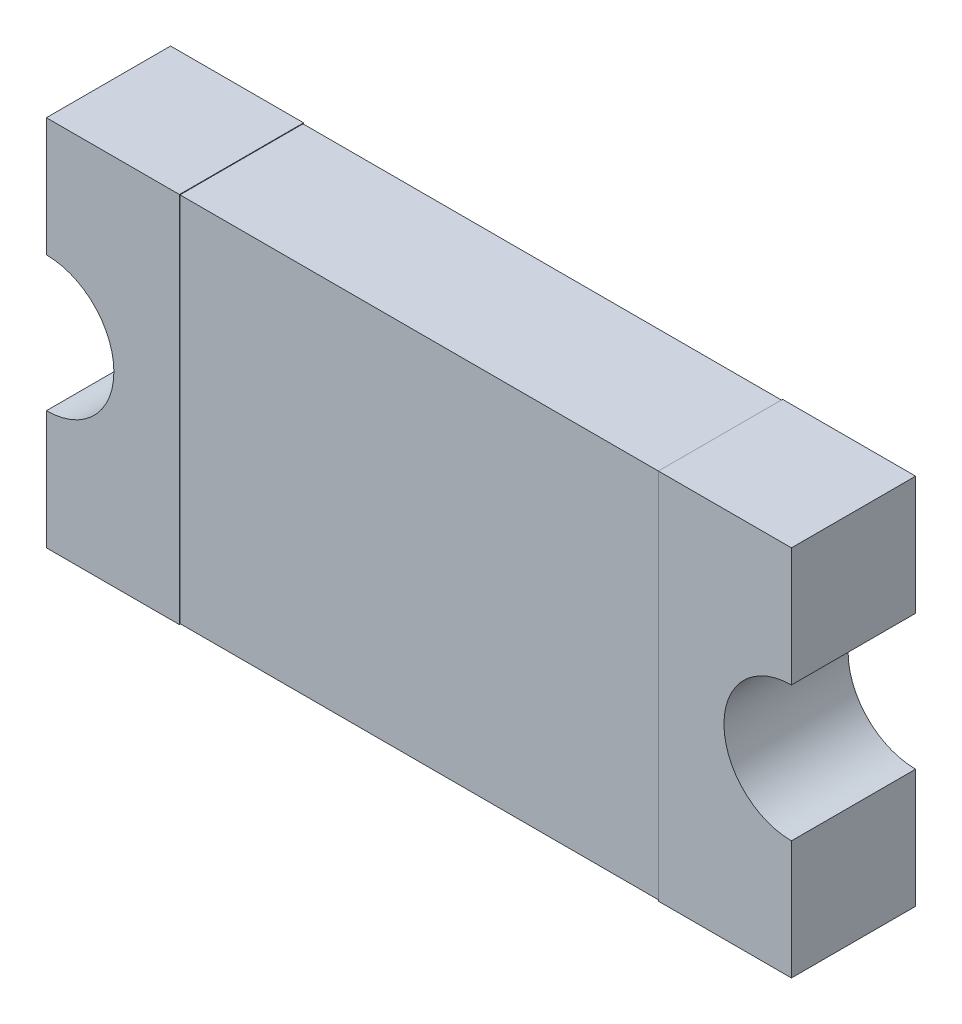
ISO-10303-21;
HEADER;
FILE_DESCRIPTION(('STEP AP214'),'2;1');
FILE_NAME('part.step','',(''),(''),'','','');
FILE_SCHEMA(('AUTOMOTIVE_DESIGN { 1 0 10303 214 1 1 1 1 }'));
ENDSEC;
DATA;
#1=APPLICATION_CONTEXT('core data for automotive mechanical design processes');
#2=APPLICATION_PROTOCOL_DEFINITION('international standard','automotive_design',2000,#1);
#3=PRODUCT_CONTEXT('',#1,'mechanical');
#4=PRODUCT('Part','Part','',(#3));
#5=PRODUCT_RELATED_PRODUCT_CATEGORY('part','',(#4));
#6=PRODUCT_DEFINITION_FORMATION('','',#4);
#7=PRODUCT_DEFINITION_CONTEXT('part definition',#1,'design');
#8=PRODUCT_DEFINITION('design','',#6,#7);
#9=PRODUCT_DEFINITION_SHAPE('','',#8);
#10=(LENGTH_UNIT() NAMED_UNIT(*) SI_UNIT(.MILLI.,.METRE.));
#11=(NAMED_UNIT(*) PLANE_ANGLE_UNIT() SI_UNIT($,.RADIAN.));
#12=(NAMED_UNIT(*) SI_UNIT($,.STERADIAN.) SOLID_ANGLE_UNIT());
#13=UNCERTAINTY_MEASURE_WITH_UNIT(LENGTH_MEASURE(1.E-05),#10,'distance_accuracy_value','');
#14=(GEOMETRIC_REPRESENTATION_CONTEXT(3) GLOBAL_UNCERTAINTY_ASSIGNED_CONTEXT((#13)) GLOBAL_UNIT_ASSIGNED_CONTEXT((#10,
#11,#12)) REPRESENTATION_CONTEXT('',''));
#15=CARTESIAN_POINT('',(0.,0.,0.));
#16=DIRECTION('',(0.,0.,1.));
#17=DIRECTION('',(1.,0.,0.));
#18=AXIS2_PLACEMENT_3D('',#15,#16,#17);
#19=CARTESIAN_POINT('',(3.2004,0.8001,-3.3431275048745));
#20=DIRECTION('',(0.,0.,1.));
#21=DIRECTION('',(1.,0.,0.));
#22=AXIS2_PLACEMENT_3D('',#19,#20,#21);
#23=CYLINDRICAL_SURFACE('',#22,0.289916589658949);
#24=DIRECTION('',(0.,0.,-1.));
#25=VECTOR('',#24,1.);
#26=CARTESIAN_POINT('',(3.2004,0.510183410341051,-3.3431275048745));
#27=LINE('',#26,#25);
#28=CARTESIAN_POINT('',(3.2004,0.510183410341051,0.5334));
#29=VERTEX_POINT('',#28);
#30=CARTESIAN_POINT('',(3.2004,0.510183410341051,0.));
#31=VERTEX_POINT('',#30);
#32=EDGE_CURVE('E261',#29,#31,#27,.T.);
#33=ORIENTED_EDGE('',*,*,#32,.T.);
#34=CARTESIAN_POINT('',(3.2004,0.8001,0.));
#35=DIRECTION('',(0.,0.,-1.));
#36=DIRECTION('',(1.,0.,0.));
#37=AXIS2_PLACEMENT_3D('',#34,#35,#36);
#38=CIRCLE('',#37,0.289916589658949);
#39=CARTESIAN_POINT('',(3.2004,1.09001658965895,0.));
#40=VERTEX_POINT('',#39);
#41=EDGE_CURVE('E152',#31,#40,#38,.T.);
#42=ORIENTED_EDGE('',*,*,#41,.T.);
#43=DIRECTION('',(0.,0.,1.));
#44=VECTOR('',#43,1.);
#45=CARTESIAN_POINT('',(3.2004,1.09001658965895,-3.3431275048745));
#46=LINE('',#45,#44);
#47=CARTESIAN_POINT('',(3.2004,1.09001658965895,0.5334));
#48=VERTEX_POINT('',#47);
#49=EDGE_CURVE('E191',#40,#48,#46,.T.);
#50=ORIENTED_EDGE('',*,*,#49,.T.);
#51=CARTESIAN_POINT('',(3.2004,0.8001,0.5334));
#52=DIRECTION('',(0.,0.,-1.));
#53=DIRECTION('',(1.,0.,0.));
#54=AXIS2_PLACEMENT_3D('',#51,#52,#53);
#55=CIRCLE('',#54,0.289916589658949);
#56=EDGE_CURVE('E216',#29,#48,#55,.T.);
#57=ORIENTED_EDGE('',*,*,#56,.F.);
#58=EDGE_LOOP('',(#33,#42,#50,#57));
#59=FACE_BOUND('',#58,.T.);
#60=ADVANCED_FACE('F17',(#59),#23,.F.);
#61=CARTESIAN_POINT('',(0.,0.8001,-3.3431275048745));
#62=DIRECTION('',(0.,0.,1.));
#63=DIRECTION('',(1.,0.,0.));
#64=AXIS2_PLACEMENT_3D('',#61,#62,#63);
#65=CYLINDRICAL_SURFACE('',#64,0.289916589658949);
#66=DIRECTION('',(0.,0.,-1.));
#67=VECTOR('',#66,1.);
#68=CARTESIAN_POINT('',(0.,1.09001658965895,-3.3431275048745));
#69=LINE('',#68,#67);
#70=CARTESIAN_POINT('',(0.,1.09001658965895,0.5334));
#71=VERTEX_POINT('',#70);
#72=CARTESIAN_POINT('',(0.,1.09001658965895,0.));
#73=VERTEX_POINT('',#72);
#74=EDGE_CURVE('E242',#71,#73,#69,.T.);
#75=ORIENTED_EDGE('',*,*,#74,.T.);
#76=CARTESIAN_POINT('',(0.,0.8001,0.));
#77=DIRECTION('',(0.,0.,-1.));
#78=DIRECTION('',(1.,0.,0.));
#79=AXIS2_PLACEMENT_3D('',#76,#77,#78);
#80=CIRCLE('',#79,0.289916589658949);
#81=CARTESIAN_POINT('',(0.,0.510183410341051,0.));
#82=VERTEX_POINT('',#81);
#83=EDGE_CURVE('E140',#73,#82,#80,.T.);
#84=ORIENTED_EDGE('',*,*,#83,.T.);
#85=DIRECTION('',(0.,0.,1.));
#86=VECTOR('',#85,1.);
#87=CARTESIAN_POINT('',(0.,0.510183410341051,-3.3431275048745));
#88=LINE('',#87,#86);
#89=CARTESIAN_POINT('',(0.,0.510183410341051,0.5334));
#90=VERTEX_POINT('',#89);
#91=EDGE_CURVE('E167',#82,#90,#88,.T.);
#92=ORIENTED_EDGE('',*,*,#91,.T.);
#93=CARTESIAN_POINT('',(0.,0.8001,0.5334));
#94=DIRECTION('',(0.,0.,-1.));
#95=DIRECTION('',(1.,0.,0.));
#96=AXIS2_PLACEMENT_3D('',#93,#94,#95);
#97=CIRCLE('',#96,0.289916589658949);
#98=EDGE_CURVE('E213',#71,#90,#97,.T.);
#99=ORIENTED_EDGE('',*,*,#98,.F.);
#100=EDGE_LOOP('',(#75,#84,#92,#99));
#101=FACE_BOUND('',#100,.T.);
#102=ADVANCED_FACE('F415',(#101),#65,.F.);
#103=CARTESIAN_POINT('',(0.5715,3.61769481299902,0.00253999999999982));
#104=DIRECTION('',(0.,0.,-1.));
#105=DIRECTION('',(0.,-1.,0.));
#106=AXIS2_PLACEMENT_3D('',#103,#104,#105);
#107=PLANE('',#106);
#108=DIRECTION('',(-1.,0.,0.));
#109=VECTOR('',#108,1.);
#110=CARTESIAN_POINT('',(2.6289,0.00254000000000012,0.00253999999999966));
#111=LINE('',#110,#109);
#112=CARTESIAN_POINT('',(2.6289,0.00254000000000009,0.00253999999999982));
#113=VERTEX_POINT('',#112);
#114=CARTESIAN_POINT('',(0.5715,0.00254000000000009,0.00253999999999982));
#115=VERTEX_POINT('',#114);
#116=EDGE_CURVE('E156',#113,#115,#111,.T.);
#117=ORIENTED_EDGE('',*,*,#116,.T.);
#118=DIRECTION('',(0.,-1.,0.));
#119=VECTOR('',#118,1.);
#120=CARTESIAN_POINT('',(0.5715,3.61769481299902,0.00253999999999982));
#121=LINE('',#120,#119);
#122=CARTESIAN_POINT('',(0.5715,1.59766,0.00253999999999982));
#123=VERTEX_POINT('',#122);
#124=EDGE_CURVE('E161',#123,#115,#121,.T.);
#125=ORIENTED_EDGE('',*,*,#124,.F.);
#126=DIRECTION('',(1.,0.,0.));
#127=VECTOR('',#126,1.);
#128=CARTESIAN_POINT('',(0.5715,1.59766,0.00253999999999966));
#129=LINE('',#128,#127);
#130=CARTESIAN_POINT('',(2.6289,1.59766,0.00253999999999982));
#131=VERTEX_POINT('',#130);
#132=EDGE_CURVE('E238',#123,#131,#129,.T.);
#133=ORIENTED_EDGE('',*,*,#132,.T.);
#134=DIRECTION('',(0.,-1.,0.));
#135=VECTOR('',#134,1.);
#136=CARTESIAN_POINT('',(2.6289,3.61769481299902,0.00253999999999982));
#137=LINE('',#136,#135);
#138=EDGE_CURVE('E28',#131,#113,#137,.T.);
#139=ORIENTED_EDGE('',*,*,#138,.T.);
#140=EDGE_LOOP('',(#117,#125,#133,#139));
#141=FACE_BOUND('',#140,.T.);
#142=ADVANCED_FACE('F373',(#141),#107,.T.);
#143=CARTESIAN_POINT('',(0.,0.,0.53086));
#144=DIRECTION('',(0.,0.,-1.));
#145=DIRECTION('',(0.,-1.,0.));
#146=AXIS2_PLACEMENT_3D('',#143,#144,#145);
#147=PLANE('',#146);
#148=DIRECTION('',(0.,-1.,0.));
#149=VECTOR('',#148,1.);
#150=CARTESIAN_POINT('',(2.6289,1.6002,0.53086));
#151=LINE('',#150,#149);
#152=CARTESIAN_POINT('',(2.6289,1.59766,0.53086));
#153=VERTEX_POINT('',#152);
#154=CARTESIAN_POINT('',(2.6289,0.00254000000000012,0.53086));
#155=VERTEX_POINT('',#154);
#156=EDGE_CURVE('E11',#153,#155,#151,.T.);
#157=ORIENTED_EDGE('',*,*,#156,.F.);
#158=DIRECTION('',(1.,0.,0.));
#159=VECTOR('',#158,1.);
#160=CARTESIAN_POINT('',(0.5715,1.59766,0.53086));
#161=LINE('',#160,#159);
#162=CARTESIAN_POINT('',(0.5715,1.59766,0.53086));
#163=VERTEX_POINT('',#162);
#164=EDGE_CURVE('E177',#163,#153,#161,.T.);
#165=ORIENTED_EDGE('',*,*,#164,.F.);
#166=DIRECTION('',(0.,1.,0.));
#167=VECTOR('',#166,1.);
#168=CARTESIAN_POINT('',(0.5715,0.,0.53086));
#169=LINE('',#168,#167);
#170=CARTESIAN_POINT('',(0.5715,0.00253999999999988,0.53086));
#171=VERTEX_POINT('',#170);
#172=EDGE_CURVE('E158',#171,#163,#169,.T.);
#173=ORIENTED_EDGE('',*,*,#172,.F.);
#174=DIRECTION('',(-1.,0.,0.));
#175=VECTOR('',#174,1.);
#176=CARTESIAN_POINT('',(2.6289,0.00254000000000012,0.53086));
#177=LINE('',#176,#175);
#178=EDGE_CURVE('E217',#155,#171,#177,.T.);
#179=ORIENTED_EDGE('',*,*,#178,.F.);
#180=EDGE_LOOP('',(#157,#165,#173,#179));
#181=FACE_BOUND('',#180,.T.);
#182=ADVANCED_FACE('F398',(#181),#147,.F.);
#183=CARTESIAN_POINT('',(2.6289,1.6002,0.53086));
#184=DIRECTION('',(-1.,0.,0.));
#185=DIRECTION('',(0.,0.,1.));
#186=AXIS2_PLACEMENT_3D('',#183,#184,#185);
#187=PLANE('',#186);
#188=DIRECTION('',(0.,0.,1.));
#189=VECTOR('',#188,1.);
#190=CARTESIAN_POINT('',(2.6289,0.,0.53086));
#191=LINE('',#190,#189);
#192=CARTESIAN_POINT('',(2.6289,0.,0.));
#193=VERTEX_POINT('',#192);
#194=CARTESIAN_POINT('',(2.6289,0.,0.5334));
#195=VERTEX_POINT('',#194);
#196=EDGE_CURVE('E196',#193,#195,#191,.T.);
#197=ORIENTED_EDGE('',*,*,#196,.T.);
#198=DIRECTION('',(0.,-1.,0.));
#199=VECTOR('',#198,1.);
#200=CARTESIAN_POINT('',(2.6289,1.6002,0.5334));
#201=LINE('',#200,#199);
#202=CARTESIAN_POINT('',(2.6289,1.6002,0.5334));
#203=VERTEX_POINT('',#202);
#204=EDGE_CURVE('E124',#203,#195,#201,.T.);
#205=ORIENTED_EDGE('',*,*,#204,.F.);
#206=DIRECTION('',(0.,0.,1.));
#207=VECTOR('',#206,1.);
#208=CARTESIAN_POINT('',(2.6289,1.6002,0.53086));
#209=LINE('',#208,#207);
#210=CARTESIAN_POINT('',(2.6289,1.6002,0.));
#211=VERTEX_POINT('',#210);
#212=EDGE_CURVE('E115',#211,#203,#209,.T.);
#213=ORIENTED_EDGE('',*,*,#212,.F.);
#214=DIRECTION('',(0.,1.,0.));
#215=VECTOR('',#214,1.);
#216=CARTESIAN_POINT('',(2.6289,0.,0.));
#217=LINE('',#216,#215);
#218=EDGE_CURVE('E121',#193,#211,#217,.T.);
#219=ORIENTED_EDGE('',*,*,#218,.F.);
#220=EDGE_LOOP('',(#197,#205,#213,#219));
#221=FACE_BOUND('',#220,.T.);
#222=ORIENTED_EDGE('',*,*,#138,.F.);
#223=DIRECTION('',(0.,0.,1.));
#224=VECTOR('',#223,1.);
#225=CARTESIAN_POINT('',(2.6289,1.59766,-3.08683481299902));
#226=LINE('',#225,#224);
#227=EDGE_CURVE('E129',#131,#153,#226,.T.);
#228=ORIENTED_EDGE('',*,*,#227,.T.);
#229=ORIENTED_EDGE('',*,*,#156,.T.);
#230=DIRECTION('',(0.,0.,1.));
#231=VECTOR('',#230,1.);
#232=CARTESIAN_POINT('',(2.6289,0.00254000000000012,-3.08683481299902));
#233=LINE('',#232,#231);
#234=EDGE_CURVE('E221',#113,#155,#233,.T.);
#235=ORIENTED_EDGE('',*,*,#234,.F.);
#236=EDGE_LOOP('',(#222,#228,#229,#235));
#237=FACE_BOUND('',#236,.T.);
#238=ADVANCED_FACE('F118',(#221,#237),#187,.T.);
#239=CARTESIAN_POINT('',(0.5715,0.,0.53086));
#240=DIRECTION('',(1.,0.,0.));
#241=DIRECTION('',(0.,1.,0.));
#242=AXIS2_PLACEMENT_3D('',#239,#240,#241);
#243=PLANE('',#242);
#244=DIRECTION('',(0.,0.,1.));
#245=VECTOR('',#244,1.);
#246=CARTESIAN_POINT('',(0.5715,1.6002,0.53086));
#247=LINE('',#246,#245);
#248=CARTESIAN_POINT('',(0.5715,1.6002,0.));
#249=VERTEX_POINT('',#248);
#250=CARTESIAN_POINT('',(0.5715,1.6002,0.5334));
#251=VERTEX_POINT('',#250);
#252=EDGE_CURVE('E178',#249,#251,#247,.T.);
#253=ORIENTED_EDGE('',*,*,#252,.T.);
#254=DIRECTION('',(0.,1.,0.));
#255=VECTOR('',#254,1.);
#256=CARTESIAN_POINT('',(0.5715,0.,0.5334));
#257=LINE('',#256,#255);
#258=CARTESIAN_POINT('',(0.5715,0.,0.5334));
#259=VERTEX_POINT('',#258);
#260=EDGE_CURVE('E42',#259,#251,#257,.T.);
#261=ORIENTED_EDGE('',*,*,#260,.F.);
#262=DIRECTION('',(0.,0.,1.));
#263=VECTOR('',#262,1.);
#264=CARTESIAN_POINT('',(0.5715,0.,0.53086));
#265=LINE('',#264,#263);
#266=CARTESIAN_POINT('',(0.5715,0.,0.));
#267=VERTEX_POINT('',#266);
#268=EDGE_CURVE('E204',#267,#259,#265,.T.);
#269=ORIENTED_EDGE('',*,*,#268,.F.);
#270=DIRECTION('',(0.,-1.,0.));
#271=VECTOR('',#270,1.);
#272=CARTESIAN_POINT('',(0.5715,0.,0.));
#273=LINE('',#272,#271);
#274=EDGE_CURVE('E187',#249,#267,#273,.T.);
#275=ORIENTED_EDGE('',*,*,#274,.F.);
#276=EDGE_LOOP('',(#253,#261,#269,#275));
#277=FACE_BOUND('',#276,.T.);
#278=DIRECTION('',(0.,0.,1.));
#279=VECTOR('',#278,1.);
#280=CARTESIAN_POINT('',(0.5715,1.59766,-3.08683481299902));
#281=LINE('',#280,#279);
#282=EDGE_CURVE('E243',#123,#163,#281,.T.);
#283=ORIENTED_EDGE('',*,*,#282,.F.);
#284=ORIENTED_EDGE('',*,*,#124,.T.);
#285=DIRECTION('',(0.,0.,1.));
#286=VECTOR('',#285,1.);
#287=CARTESIAN_POINT('',(0.5715,0.00253999999999988,-3.08683481299902));
#288=LINE('',#287,#286);
#289=EDGE_CURVE('E220',#115,#171,#288,.T.);
#290=ORIENTED_EDGE('',*,*,#289,.T.);
#291=ORIENTED_EDGE('',*,*,#172,.T.);
#292=EDGE_LOOP('',(#283,#284,#290,#291));
#293=FACE_BOUND('',#292,.T.);
#294=ADVANCED_FACE('F378',(#277,#293),#243,.T.);
#295=CARTESIAN_POINT('',(0.,0.,0.5334));
#296=DIRECTION('',(0.,0.,1.));
#297=DIRECTION('',(1.,0.,0.));
#298=AXIS2_PLACEMENT_3D('',#295,#296,#297);
#299=PLANE('',#298);
#300=DIRECTION('',(0.,1.,0.));
#301=VECTOR('',#300,1.);
#302=CARTESIAN_POINT('',(3.2004,0.,0.5334));
#303=LINE('',#302,#301);
#304=CARTESIAN_POINT('',(3.2004,0.,0.5334));
#305=VERTEX_POINT('',#304);
#306=EDGE_CURVE('E173',#305,#29,#303,.T.);
#307=ORIENTED_EDGE('',*,*,#306,.T.);
#308=ORIENTED_EDGE('',*,*,#56,.T.);
#309=DIRECTION('',(0.,1.,0.));
#310=VECTOR('',#309,1.);
#311=CARTESIAN_POINT('',(3.2004,0.,0.5334));
#312=LINE('',#311,#310);
#313=CARTESIAN_POINT('',(3.2004,1.6002,0.5334));
#314=VERTEX_POINT('',#313);
#315=EDGE_CURVE('E194',#48,#314,#312,.T.);
#316=ORIENTED_EDGE('',*,*,#315,.T.);
#317=DIRECTION('',(-1.,0.,0.));
#318=VECTOR('',#317,1.);
#319=CARTESIAN_POINT('',(3.2004,1.6002,0.5334));
#320=LINE('',#319,#318);
#321=EDGE_CURVE('E128',#314,#203,#320,.T.);
#322=ORIENTED_EDGE('',*,*,#321,.T.);
#323=ORIENTED_EDGE('',*,*,#204,.T.);
#324=DIRECTION('',(1.,0.,0.));
#325=VECTOR('',#324,1.);
#326=CARTESIAN_POINT('',(0.,0.,0.5334));
#327=LINE('',#326,#325);
#328=EDGE_CURVE('E183',#195,#305,#327,.T.);
#329=ORIENTED_EDGE('',*,*,#328,.T.);
#330=EDGE_LOOP('',(#307,#308,#316,#322,#323,#329));
#331=FACE_BOUND('',#330,.T.);
#332=ADVANCED_FACE('F347',(#331),#299,.T.);
#333=CARTESIAN_POINT('',(0.,0.,0.5334));
#334=DIRECTION('',(0.,0.,1.));
#335=DIRECTION('',(1.,0.,0.));
#336=AXIS2_PLACEMENT_3D('',#333,#334,#335);
#337=PLANE('',#336);
#338=DIRECTION('',(0.,-1.,0.));
#339=VECTOR('',#338,1.);
#340=CARTESIAN_POINT('',(0.,1.6002,0.5334));
#341=LINE('',#340,#339);
#342=CARTESIAN_POINT('',(0.,1.6002,0.5334));
#343=VERTEX_POINT('',#342);
#344=EDGE_CURVE('E266',#343,#71,#341,.T.);
#345=ORIENTED_EDGE('',*,*,#344,.T.);
#346=ORIENTED_EDGE('',*,*,#98,.T.);
#347=DIRECTION('',(0.,-1.,0.));
#348=VECTOR('',#347,1.);
#349=CARTESIAN_POINT('',(0.,1.6002,0.5334));
#350=LINE('',#349,#348);
#351=CARTESIAN_POINT('',(0.,0.,0.5334));
#352=VERTEX_POINT('',#351);
#353=EDGE_CURVE('E21',#90,#352,#350,.T.);
#354=ORIENTED_EDGE('',*,*,#353,.T.);
#355=DIRECTION('',(1.,0.,0.));
#356=VECTOR('',#355,1.);
#357=CARTESIAN_POINT('',(0.,0.,0.5334));
#358=LINE('',#357,#356);
#359=EDGE_CURVE('E199',#352,#259,#358,.T.);
#360=ORIENTED_EDGE('',*,*,#359,.T.);
#361=ORIENTED_EDGE('',*,*,#260,.T.);
#362=DIRECTION('',(-1.,0.,0.));
#363=VECTOR('',#362,1.);
#364=CARTESIAN_POINT('',(3.2004,1.6002,0.5334));
#365=LINE('',#364,#363);
#366=EDGE_CURVE('E182',#251,#343,#365,.T.);
#367=ORIENTED_EDGE('',*,*,#366,.T.);
#368=EDGE_LOOP('',(#345,#346,#354,#360,#361,#367));
#369=FACE_BOUND('',#368,.T.);
#370=ADVANCED_FACE('F301',(#369),#337,.T.);
#371=CARTESIAN_POINT('',(3.2004,1.6002,0.5334));
#372=DIRECTION('',(0.,-1.,0.));
#373=DIRECTION('',(0.,0.,-1.));
#374=AXIS2_PLACEMENT_3D('',#371,#372,#373);
#375=PLANE('',#374);
#376=ORIENTED_EDGE('',*,*,#252,.F.);
#377=DIRECTION('',(-1.,0.,0.));
#378=VECTOR('',#377,1.);
#379=CARTESIAN_POINT('',(3.2004,1.6002,0.));
#380=LINE('',#379,#378);
#381=CARTESIAN_POINT('',(0.,1.6002,0.));
#382=VERTEX_POINT('',#381);
#383=EDGE_CURVE('E184',#249,#382,#380,.T.);
#384=ORIENTED_EDGE('',*,*,#383,.T.);
#385=DIRECTION('',(0.,0.,-1.));
#386=VECTOR('',#385,1.);
#387=CARTESIAN_POINT('',(0.,1.6002,0.5334));
#388=LINE('',#387,#386);
#389=EDGE_CURVE('E234',#343,#382,#388,.T.);
#390=ORIENTED_EDGE('',*,*,#389,.F.);
#391=ORIENTED_EDGE('',*,*,#366,.F.);
#392=EDGE_LOOP('',(#376,#384,#390,#391));
#393=FACE_BOUND('',#392,.T.);
#394=ADVANCED_FACE('F434',(#393),#375,.F.);
#395=CARTESIAN_POINT('',(0.,0.,0.5334));
#396=DIRECTION('',(0.,1.,0.));
#397=DIRECTION('',(1.,0.,0.));
#398=AXIS2_PLACEMENT_3D('',#395,#396,#397);
#399=PLANE('',#398);
#400=ORIENTED_EDGE('',*,*,#196,.F.);
#401=DIRECTION('',(1.,0.,0.));
#402=VECTOR('',#401,1.);
#403=CARTESIAN_POINT('',(0.,0.,0.));
#404=LINE('',#403,#402);
#405=CARTESIAN_POINT('',(3.2004,0.,0.));
#406=VERTEX_POINT('',#405);
#407=EDGE_CURVE('E145',#193,#406,#404,.T.);
#408=ORIENTED_EDGE('',*,*,#407,.T.);
#409=DIRECTION('',(0.,0.,-1.));
#410=VECTOR('',#409,1.);
#411=CARTESIAN_POINT('',(3.2004,0.,0.5334));
#412=LINE('',#411,#410);
#413=EDGE_CURVE('E168',#305,#406,#412,.T.);
#414=ORIENTED_EDGE('',*,*,#413,.F.);
#415=ORIENTED_EDGE('',*,*,#328,.F.);
#416=EDGE_LOOP('',(#400,#408,#414,#415));
#417=FACE_BOUND('',#416,.T.);
#418=ADVANCED_FACE('F359',(#417),#399,.F.);
#419=CARTESIAN_POINT('',(0.,0.,0.5334));
#420=DIRECTION('',(0.,1.,0.));
#421=DIRECTION('',(1.,0.,0.));
#422=AXIS2_PLACEMENT_3D('',#419,#420,#421);
#423=PLANE('',#422);
#424=DIRECTION('',(1.,0.,0.));
#425=VECTOR('',#424,1.);
#426=CARTESIAN_POINT('',(0.,0.,0.));
#427=LINE('',#426,#425);
#428=CARTESIAN_POINT('',(0.,0.,0.));
#429=VERTEX_POINT('',#428);
#430=EDGE_CURVE('E229',#429,#267,#427,.T.);
#431=ORIENTED_EDGE('',*,*,#430,.T.);
#432=ORIENTED_EDGE('',*,*,#268,.T.);
#433=ORIENTED_EDGE('',*,*,#359,.F.);
#434=DIRECTION('',(0.,0.,-1.));
#435=VECTOR('',#434,1.);
#436=CARTESIAN_POINT('',(0.,0.,0.5334));
#437=LINE('',#436,#435);
#438=EDGE_CURVE('E166',#352,#429,#437,.T.);
#439=ORIENTED_EDGE('',*,*,#438,.T.);
#440=EDGE_LOOP('',(#431,#432,#433,#439));
#441=FACE_BOUND('',#440,.T.);
#442=ADVANCED_FACE('F318',(#441),#423,.F.);
#443=CARTESIAN_POINT('',(3.2004,1.6002,0.5334));
#444=DIRECTION('',(0.,-1.,0.));
#445=DIRECTION('',(0.,0.,-1.));
#446=AXIS2_PLACEMENT_3D('',#443,#444,#445);
#447=PLANE('',#446);
#448=DIRECTION('',(-1.,0.,0.));
#449=VECTOR('',#448,1.);
#450=CARTESIAN_POINT('',(3.2004,1.6002,0.));
#451=LINE('',#450,#449);
#452=CARTESIAN_POINT('',(3.2004,1.6002,0.));
#453=VERTEX_POINT('',#452);
#454=EDGE_CURVE('E132',#453,#211,#451,.T.);
#455=ORIENTED_EDGE('',*,*,#454,.T.);
#456=ORIENTED_EDGE('',*,*,#212,.T.);
#457=ORIENTED_EDGE('',*,*,#321,.F.);
#458=DIRECTION('',(0.,0.,-1.));
#459=VECTOR('',#458,1.);
#460=CARTESIAN_POINT('',(3.2004,1.6002,0.5334));
#461=LINE('',#460,#459);
#462=EDGE_CURVE('E135',#314,#453,#461,.T.);
#463=ORIENTED_EDGE('',*,*,#462,.T.);
#464=EDGE_LOOP('',(#455,#456,#457,#463));
#465=FACE_BOUND('',#464,.T.);
#466=ADVANCED_FACE('F133',(#465),#447,.F.);
#467=CARTESIAN_POINT('',(0.5715,1.59766,-3.08683481299902));
#468=DIRECTION('',(0.,-1.,0.));
#469=DIRECTION('',(0.,0.,-1.));
#470=AXIS2_PLACEMENT_3D('',#467,#468,#469);
#471=PLANE('',#470);
#472=ORIENTED_EDGE('',*,*,#132,.F.);
#473=ORIENTED_EDGE('',*,*,#282,.T.);
#474=ORIENTED_EDGE('',*,*,#164,.T.);
#475=ORIENTED_EDGE('',*,*,#227,.F.);
#476=EDGE_LOOP('',(#472,#473,#474,#475));
#477=FACE_BOUND('',#476,.T.);
#478=ADVANCED_FACE('F402',(#477),#471,.F.);
#479=CARTESIAN_POINT('',(2.6289,0.00254000000000012,-3.08683481299902));
#480=DIRECTION('',(0.,1.,0.));
#481=DIRECTION('',(1.,0.,0.));
#482=AXIS2_PLACEMENT_3D('',#479,#480,#481);
#483=PLANE('',#482);
#484=ORIENTED_EDGE('',*,*,#116,.F.);
#485=ORIENTED_EDGE('',*,*,#234,.T.);
#486=ORIENTED_EDGE('',*,*,#178,.T.);
#487=ORIENTED_EDGE('',*,*,#289,.F.);
#488=EDGE_LOOP('',(#484,#485,#486,#487));
#489=FACE_BOUND('',#488,.T.);
#490=ADVANCED_FACE('F19',(#489),#483,.F.);
#491=CARTESIAN_POINT('',(0.,0.,0.));
#492=DIRECTION('',(0.,0.,1.));
#493=DIRECTION('',(1.,0.,0.));
#494=AXIS2_PLACEMENT_3D('',#491,#492,#493);
#495=PLANE('',#494);
#496=ORIENTED_EDGE('',*,*,#83,.F.);
#497=DIRECTION('',(0.,-1.,0.));
#498=VECTOR('',#497,1.);
#499=CARTESIAN_POINT('',(0.,1.6002,0.));
#500=LINE('',#499,#498);
#501=EDGE_CURVE('E230',#382,#73,#500,.T.);
#502=ORIENTED_EDGE('',*,*,#501,.F.);
#503=ORIENTED_EDGE('',*,*,#383,.F.);
#504=ORIENTED_EDGE('',*,*,#274,.T.);
#505=ORIENTED_EDGE('',*,*,#430,.F.);
#506=DIRECTION('',(0.,-1.,0.));
#507=VECTOR('',#506,1.);
#508=CARTESIAN_POINT('',(0.,1.6002,0.));
#509=LINE('',#508,#507);
#510=EDGE_CURVE('E162',#82,#429,#509,.T.);
#511=ORIENTED_EDGE('',*,*,#510,.F.);
#512=EDGE_LOOP('',(#496,#502,#503,#504,#505,#511));
#513=FACE_BOUND('',#512,.T.);
#514=ADVANCED_FACE('F313',(#513),#495,.F.);
#515=CARTESIAN_POINT('',(0.,0.,0.));
#516=DIRECTION('',(0.,0.,1.));
#517=DIRECTION('',(1.,0.,0.));
#518=AXIS2_PLACEMENT_3D('',#515,#516,#517);
#519=PLANE('',#518);
#520=ORIENTED_EDGE('',*,*,#41,.F.);
#521=DIRECTION('',(0.,1.,0.));
#522=VECTOR('',#521,1.);
#523=CARTESIAN_POINT('',(3.2004,0.,0.));
#524=LINE('',#523,#522);
#525=EDGE_CURVE('E172',#406,#31,#524,.T.);
#526=ORIENTED_EDGE('',*,*,#525,.F.);
#527=ORIENTED_EDGE('',*,*,#407,.F.);
#528=ORIENTED_EDGE('',*,*,#218,.T.);
#529=ORIENTED_EDGE('',*,*,#454,.F.);
#530=DIRECTION('',(0.,1.,0.));
#531=VECTOR('',#530,1.);
#532=CARTESIAN_POINT('',(3.2004,0.,0.));
#533=LINE('',#532,#531);
#534=EDGE_CURVE('E195',#40,#453,#533,.T.);
#535=ORIENTED_EDGE('',*,*,#534,.F.);
#536=EDGE_LOOP('',(#520,#526,#527,#528,#529,#535));
#537=FACE_BOUND('',#536,.T.);
#538=ADVANCED_FACE('F142',(#537),#519,.F.);
#539=CARTESIAN_POINT('',(0.,1.6002,0.5334));
#540=DIRECTION('',(1.,0.,0.));
#541=DIRECTION('',(0.,1.,0.));
#542=AXIS2_PLACEMENT_3D('',#539,#540,#541);
#543=PLANE('',#542);
#544=ORIENTED_EDGE('',*,*,#91,.F.);
#545=ORIENTED_EDGE('',*,*,#510,.T.);
#546=ORIENTED_EDGE('',*,*,#438,.F.);
#547=ORIENTED_EDGE('',*,*,#353,.F.);
#548=EDGE_LOOP('',(#544,#545,#546,#547));
#549=FACE_BOUND('',#548,.T.);
#550=ADVANCED_FACE('F306',(#549),#543,.F.);
#551=CARTESIAN_POINT('',(0.,1.6002,0.5334));
#552=DIRECTION('',(1.,0.,0.));
#553=DIRECTION('',(0.,1.,0.));
#554=AXIS2_PLACEMENT_3D('',#551,#552,#553);
#555=PLANE('',#554);
#556=ORIENTED_EDGE('',*,*,#74,.F.);
#557=ORIENTED_EDGE('',*,*,#344,.F.);
#558=ORIENTED_EDGE('',*,*,#389,.T.);
#559=ORIENTED_EDGE('',*,*,#501,.T.);
#560=EDGE_LOOP('',(#556,#557,#558,#559));
#561=FACE_BOUND('',#560,.T.);
#562=ADVANCED_FACE('F424',(#561),#555,.F.);
#563=CARTESIAN_POINT('',(3.2004,0.,0.5334));
#564=DIRECTION('',(-1.,0.,0.));
#565=DIRECTION('',(0.,0.,1.));
#566=AXIS2_PLACEMENT_3D('',#563,#564,#565);
#567=PLANE('',#566);
#568=ORIENTED_EDGE('',*,*,#49,.F.);
#569=ORIENTED_EDGE('',*,*,#534,.T.);
#570=ORIENTED_EDGE('',*,*,#462,.F.);
#571=ORIENTED_EDGE('',*,*,#315,.F.);
#572=EDGE_LOOP('',(#568,#569,#570,#571));
#573=FACE_BOUND('',#572,.T.);
#574=ADVANCED_FACE('F353',(#573),#567,.F.);
#575=CARTESIAN_POINT('',(3.2004,0.,0.5334));
#576=DIRECTION('',(-1.,0.,0.));
#577=DIRECTION('',(0.,0.,1.));
#578=AXIS2_PLACEMENT_3D('',#575,#576,#577);
#579=PLANE('',#578);
#580=ORIENTED_EDGE('',*,*,#32,.F.);
#581=ORIENTED_EDGE('',*,*,#306,.F.);
#582=ORIENTED_EDGE('',*,*,#413,.T.);
#583=ORIENTED_EDGE('',*,*,#525,.T.);
#584=EDGE_LOOP('',(#580,#581,#582,#583));
#585=FACE_BOUND('',#584,.T.);
#586=ADVANCED_FACE('F355',(#585),#579,.F.);
#587=CLOSED_SHELL('',(#60,#102,#142,#182,#238,#294,#332,#370,#394,#418,#442,#466,#478,#490,#514,
#538,#550,#562,#574,#586));
#588=MANIFOLD_SOLID_BREP('B1',#587);
#589=ADVANCED_BREP_SHAPE_REPRESENTATION('',(#18,#588),#14);
#590=SHAPE_DEFINITION_REPRESENTATION(#9,#589);
ENDSEC;
END-ISO-10303-21;
